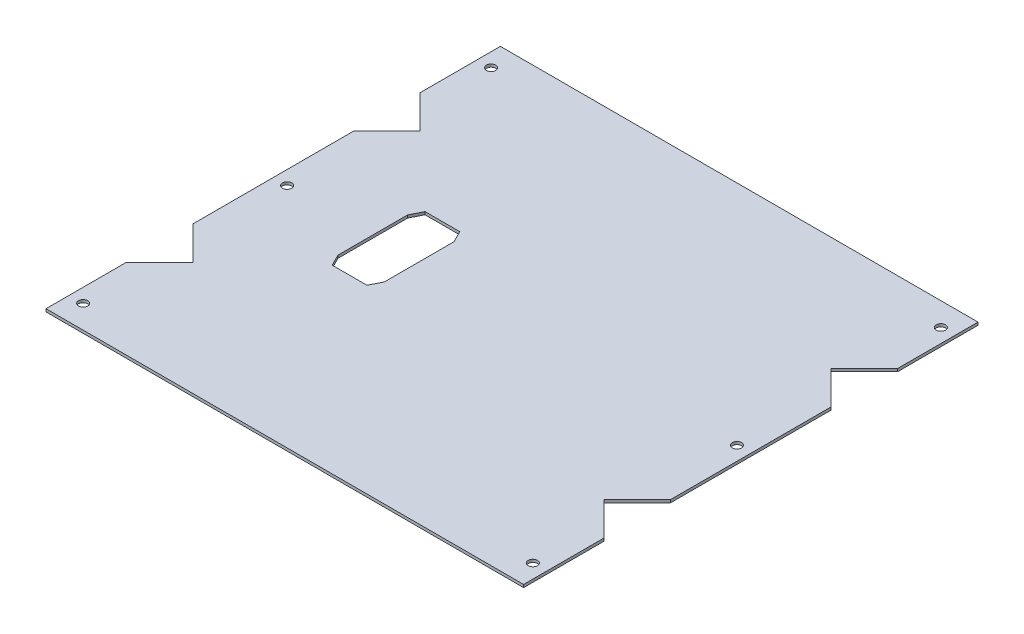
ISO-10303-21;
HEADER;
FILE_DESCRIPTION(('STEP AP214'),'2;1');
FILE_NAME('part.step','',(''),(''),'','','');
FILE_SCHEMA(('AUTOMOTIVE_DESIGN { 1 0 10303 214 1 1 1 1 }'));
ENDSEC;
DATA;
#1=APPLICATION_CONTEXT('core data for automotive mechanical design processes');
#2=APPLICATION_PROTOCOL_DEFINITION('international standard','automotive_design',2000,#1);
#3=PRODUCT_CONTEXT('',#1,'mechanical');
#4=PRODUCT('Part','Part','',(#3));
#5=PRODUCT_RELATED_PRODUCT_CATEGORY('part','',(#4));
#6=PRODUCT_DEFINITION_FORMATION('','',#4);
#7=PRODUCT_DEFINITION_CONTEXT('part definition',#1,'design');
#8=PRODUCT_DEFINITION('design','',#6,#7);
#9=PRODUCT_DEFINITION_SHAPE('','',#8);
#10=(LENGTH_UNIT() NAMED_UNIT(*) SI_UNIT(.MILLI.,.METRE.));
#11=(NAMED_UNIT(*) PLANE_ANGLE_UNIT() SI_UNIT($,.RADIAN.));
#12=(NAMED_UNIT(*) SI_UNIT($,.STERADIAN.) SOLID_ANGLE_UNIT());
#13=UNCERTAINTY_MEASURE_WITH_UNIT(LENGTH_MEASURE(1.E-05),#10,'distance_accuracy_value','');
#14=(GEOMETRIC_REPRESENTATION_CONTEXT(3) GLOBAL_UNCERTAINTY_ASSIGNED_CONTEXT((#13)) GLOBAL_UNIT_ASSIGNED_CONTEXT((#10,
#11,#12)) REPRESENTATION_CONTEXT('',''));
#15=CARTESIAN_POINT('',(0.,0.,0.));
#16=DIRECTION('',(0.,0.,1.));
#17=DIRECTION('',(1.,0.,0.));
#18=AXIS2_PLACEMENT_3D('',#15,#16,#17);
#19=CARTESIAN_POINT('',(0.,-1.2,0.));
#20=DIRECTION('',(0.,-1.,0.));
#21=DIRECTION('',(0.,0.,-1.));
#22=AXIS2_PLACEMENT_3D('',#19,#20,#21);
#23=PLANE('',#22);
#24=DIRECTION('',(0.707106781186546,0.,-0.707106781186549));
#25=VECTOR('',#24,1.);
#26=CARTESIAN_POINT('',(90.1247785636564,-1.19999999999997,47.4464466094067));
#27=LINE('',#26,#25);
#28=CARTESIAN_POINT('',(88.6088358912349,-1.19999999999996,48.9623892818283));
#29=VERTEX_POINT('',#28);
#30=CARTESIAN_POINT('',(102.924778563656,-1.20000000000005,34.6464466094067));
#31=VERTEX_POINT('',#30);
#32=EDGE_CURVE('E878',#29,#31,#27,.T.);
#33=ORIENTED_EDGE('',*,*,#32,.F.);
#34=DIRECTION('',(-0.707106781186546,0.,-0.707106781186549));
#35=VECTOR('',#34,1.);
#36=CARTESIAN_POINT('',(124.884275797213,-1.20000000000044,85.2378291878067));
#37=LINE('',#36,#35);
#38=CARTESIAN_POINT('',(102.924778563656,-1.20000000000017,63.2783319542498));
#39=VERTEX_POINT('',#38);
#40=EDGE_CURVE('E749',#39,#29,#37,.T.);
#41=ORIENTED_EDGE('',*,*,#40,.F.);
#42=DIRECTION('',(0.,0.,1.));
#43=VECTOR('',#42,1.);
#44=CARTESIAN_POINT('',(102.924778563656,-1.20000000000006,49.1247785636563));
#45=LINE('',#44,#43);
#46=CARTESIAN_POINT('',(102.924778563656,-1.2000000000004,97.9247785636565));
#47=VERTEX_POINT('',#46);
#48=EDGE_CURVE('E775',#39,#47,#45,.T.);
#49=ORIENTED_EDGE('',*,*,#48,.T.);
#50=DIRECTION('',(-1.,0.,0.));
#51=VECTOR('',#50,1.);
#52=CARTESIAN_POINT('',(137.924778563656,-1.20000000000064,97.9247785636565));
#53=LINE('',#52,#51);
#54=CARTESIAN_POINT('',(-102.924778563656,-1.2000000000004,97.9247785636565));
#55=VERTEX_POINT('',#54);
#56=EDGE_CURVE('E772',#47,#55,#53,.T.);
#57=ORIENTED_EDGE('',*,*,#56,.T.);
#58=DIRECTION('',(0.,0.,-1.));
#59=VECTOR('',#58,1.);
#60=CARTESIAN_POINT('',(-102.924778563656,-1.20000000000008,49.1247785636563));
#61=LINE('',#60,#59);
#62=CARTESIAN_POINT('',(-102.924778563656,-1.20000000000018,63.2783319542498));
#63=VERTEX_POINT('',#62);
#64=EDGE_CURVE('E764',#55,#63,#61,.T.);
#65=ORIENTED_EDGE('',*,*,#64,.T.);
#66=DIRECTION('',(-0.707106781186546,0.,0.707106781186549));
#67=VECTOR('',#66,1.);
#68=CARTESIAN_POINT('',(-90.1247785636564,-1.2,50.4783319542498));
#69=LINE('',#68,#67);
#70=CARTESIAN_POINT('',(-88.6088358912349,-1.19999999999999,48.9623892818283));
#71=VERTEX_POINT('',#70);
#72=EDGE_CURVE('E761',#71,#63,#69,.T.);
#73=ORIENTED_EDGE('',*,*,#72,.F.);
#74=DIRECTION('',(0.707106781186546,0.,0.707106781186549));
#75=VECTOR('',#74,1.);
#76=CARTESIAN_POINT('',(-157.837189477156,-1.20000000000048,-20.2659643040926));
#77=LINE('',#76,#75);
#78=CARTESIAN_POINT('',(-102.924778563656,-1.2000000000001,34.6464466094067));
#79=VERTEX_POINT('',#78);
#80=EDGE_CURVE('E918',#79,#71,#77,.T.);
#81=ORIENTED_EDGE('',*,*,#80,.F.);
#82=DIRECTION('',(0.,0.,-1.));
#83=VECTOR('',#82,1.);
#84=CARTESIAN_POINT('',(-102.924778563656,-1.20000000000012,0.));
#85=LINE('',#84,#83);
#86=CARTESIAN_POINT('',(-102.924778563656,-1.20000000000013,-34.6464466094066));
#87=VERTEX_POINT('',#86);
#88=EDGE_CURVE('E926',#79,#87,#85,.T.);
#89=ORIENTED_EDGE('',*,*,#88,.T.);
#90=DIRECTION('',(-0.707106781186545,0.,0.70710678118655));
#91=VECTOR('',#90,1.);
#92=CARTESIAN_POINT('',(-90.1247785636564,-1.20000000000005,-47.4464466094067));
#93=LINE('',#92,#91);
#94=CARTESIAN_POINT('',(-88.6088358912349,-1.20000000000005,-48.9623892818282));
#95=VERTEX_POINT('',#94);
#96=EDGE_CURVE('E906',#95,#87,#93,.T.);
#97=ORIENTED_EDGE('',*,*,#96,.F.);
#98=DIRECTION('',(0.707106781186545,0.,0.70710678118655));
#99=VECTOR('',#98,1.);
#100=CARTESIAN_POINT('',(-124.884275797213,-1.20000000000034,-85.2378291878066));
#101=LINE('',#100,#99);
#102=CARTESIAN_POINT('',(-102.924778563656,-1.20000000000014,-63.2783319542498));
#103=VERTEX_POINT('',#102);
#104=EDGE_CURVE('E814',#103,#95,#101,.T.);
#105=ORIENTED_EDGE('',*,*,#104,.F.);
#106=DIRECTION('',(0.,0.,-1.));
#107=VECTOR('',#106,1.);
#108=CARTESIAN_POINT('',(-102.924778563656,-1.20000000000009,-49.1247785636564));
#109=LINE('',#108,#107);
#110=CARTESIAN_POINT('',(-102.924778563656,-1.20000000000026,-97.9247785636564));
#111=VERTEX_POINT('',#110);
#112=EDGE_CURVE('E827',#103,#111,#109,.T.);
#113=ORIENTED_EDGE('',*,*,#112,.T.);
#114=DIRECTION('',(1.,0.,0.));
#115=VECTOR('',#114,1.);
#116=CARTESIAN_POINT('',(137.924778563656,-1.2000000000005,-97.9247785636564));
#117=LINE('',#116,#115);
#118=CARTESIAN_POINT('',(102.924778563656,-1.20000000000026,-97.9247785636564));
#119=VERTEX_POINT('',#118);
#120=EDGE_CURVE('E839',#111,#119,#117,.T.);
#121=ORIENTED_EDGE('',*,*,#120,.T.);
#122=DIRECTION('',(0.,0.,1.));
#123=VECTOR('',#122,1.);
#124=CARTESIAN_POINT('',(102.924778563656,-1.20000000000009,-49.1247785636564));
#125=LINE('',#124,#123);
#126=CARTESIAN_POINT('',(102.924778563656,-1.20000000000014,-63.2783319542498));
#127=VERTEX_POINT('',#126);
#128=EDGE_CURVE('E835',#119,#127,#125,.T.);
#129=ORIENTED_EDGE('',*,*,#128,.T.);
#130=DIRECTION('',(0.707106781186545,0.,-0.70710678118655));
#131=VECTOR('',#130,1.);
#132=CARTESIAN_POINT('',(90.1247785636564,-1.20000000000001,-50.4783319542497));
#133=LINE('',#132,#131);
#134=CARTESIAN_POINT('',(88.6088358912349,-1.2,-48.9623892818282));
#135=VERTEX_POINT('',#134);
#136=EDGE_CURVE('E824',#135,#127,#133,.T.);
#137=ORIENTED_EDGE('',*,*,#136,.F.);
#138=DIRECTION('',(-0.707106781186545,0.,-0.70710678118655));
#139=VECTOR('',#138,1.);
#140=CARTESIAN_POINT('',(157.837189477155,-1.20000000000045,20.2659643040927));
#141=LINE('',#140,#139);
#142=CARTESIAN_POINT('',(102.924778563656,-1.20000000000008,-34.6464466094066));
#143=VERTEX_POINT('',#142);
#144=EDGE_CURVE('E729',#143,#135,#141,.T.);
#145=ORIENTED_EDGE('',*,*,#144,.F.);
#146=DIRECTION('',(0.,0.,1.));
#147=VECTOR('',#146,1.);
#148=CARTESIAN_POINT('',(102.924778563656,-1.20000000000006,0.));
#149=LINE('',#148,#147);
#150=EDGE_CURVE('E889',#143,#31,#149,.T.);
#151=ORIENTED_EDGE('',*,*,#150,.T.);
#152=EDGE_LOOP('',(#33,#41,#49,#57,#65,#73,#81,#89,#97,#105,#113,#121,#129,#137,#145,#151));
#153=FACE_BOUND('',#152,.T.);
#154=DIRECTION('',(-1.,0.,0.));
#155=VECTOR('',#154,1.);
#156=CARTESIAN_POINT('',(-57.5,-1.2,20.));
#157=LINE('',#156,#155);
#158=CARTESIAN_POINT('',(-42.5,-1.2,20.));
#159=VERTEX_POINT('',#158);
#160=CARTESIAN_POINT('',(-57.5,-1.2,20.));
#161=VERTEX_POINT('',#160);
#162=EDGE_CURVE('E557',#159,#161,#157,.T.);
#163=ORIENTED_EDGE('',*,*,#162,.F.);
#164=DIRECTION('',(-0.447213595499958,0.,0.894427190999916));
#165=VECTOR('',#164,1.);
#166=CARTESIAN_POINT('',(-42.5,-1.2,20.));
#167=LINE('',#166,#165);
#168=CARTESIAN_POINT('',(-40.,-1.2,15.));
#169=VERTEX_POINT('',#168);
#170=EDGE_CURVE('E964',#169,#159,#167,.T.);
#171=ORIENTED_EDGE('',*,*,#170,.F.);
#172=DIRECTION('',(0.,0.,1.));
#173=VECTOR('',#172,1.);
#174=CARTESIAN_POINT('',(-40.,-1.2,15.));
#175=LINE('',#174,#173);
#176=CARTESIAN_POINT('',(-40.,-1.2,-15.));
#177=VERTEX_POINT('',#176);
#178=EDGE_CURVE('E960',#177,#169,#175,.T.);
#179=ORIENTED_EDGE('',*,*,#178,.F.);
#180=DIRECTION('',(0.44721359549996,0.,0.894427190999915));
#181=VECTOR('',#180,1.);
#182=CARTESIAN_POINT('',(-42.5,-1.2,-20.));
#183=LINE('',#182,#181);
#184=CARTESIAN_POINT('',(-42.5,-1.2,-20.));
#185=VERTEX_POINT('',#184);
#186=EDGE_CURVE('E956',#185,#177,#183,.T.);
#187=ORIENTED_EDGE('',*,*,#186,.F.);
#188=DIRECTION('',(1.,0.,0.));
#189=VECTOR('',#188,1.);
#190=CARTESIAN_POINT('',(-57.5,-1.2,-20.));
#191=LINE('',#190,#189);
#192=CARTESIAN_POINT('',(-57.5,-1.2,-20.));
#193=VERTEX_POINT('',#192);
#194=EDGE_CURVE('E952',#193,#185,#191,.T.);
#195=ORIENTED_EDGE('',*,*,#194,.F.);
#196=DIRECTION('',(0.447213595499957,0.,-0.894427190999916));
#197=VECTOR('',#196,1.);
#198=CARTESIAN_POINT('',(-60.,-1.2,-15.));
#199=LINE('',#198,#197);
#200=CARTESIAN_POINT('',(-60.,-1.2,-15.));
#201=VERTEX_POINT('',#200);
#202=EDGE_CURVE('E948',#201,#193,#199,.T.);
#203=ORIENTED_EDGE('',*,*,#202,.F.);
#204=DIRECTION('',(0.,0.,-1.));
#205=VECTOR('',#204,1.);
#206=CARTESIAN_POINT('',(-60.,-1.2,15.));
#207=LINE('',#206,#205);
#208=CARTESIAN_POINT('',(-60.,-1.2,15.));
#209=VERTEX_POINT('',#208);
#210=EDGE_CURVE('E944',#209,#201,#207,.T.);
#211=ORIENTED_EDGE('',*,*,#210,.F.);
#212=DIRECTION('',(-0.447213595499958,0.,-0.894427190999916));
#213=VECTOR('',#212,1.);
#214=CARTESIAN_POINT('',(-57.5,-1.2,20.));
#215=LINE('',#214,#213);
#216=EDGE_CURVE('E941',#161,#209,#215,.T.);
#217=ORIENTED_EDGE('',*,*,#216,.F.);
#218=EDGE_LOOP('',(#163,#171,#179,#187,#195,#203,#211,#217));
#219=FACE_BOUND('',#218,.T.);
#220=CARTESIAN_POINT('',(-96.9247785636562,-1.2000000000003,-5.28261009814852E-13));
#221=DIRECTION('',(0.,1.,0.));
#222=DIRECTION('',(0.,0.,-1.));
#223=AXIS2_PLACEMENT_3D('',#220,#221,#222);
#224=CIRCLE('',#223,2.);
#225=CARTESIAN_POINT('',(-96.9247785636562,-1.20000000000029,-2.00000000000053));
#226=VERTEX_POINT('',#225);
#227=EDGE_CURVE('E929',#226,#226,#224,.T.);
#228=ORIENTED_EDGE('',*,*,#227,.T.);
#229=EDGE_LOOP('',(#228));
#230=FACE_BOUND('',#229,.T.);
#231=CARTESIAN_POINT('',(96.9247785636564,-1.20000000000013,0.));
#232=DIRECTION('',(0.,-1.,0.));
#233=DIRECTION('',(0.,0.,-1.));
#234=AXIS2_PLACEMENT_3D('',#231,#232,#233);
#235=CIRCLE('',#234,2.);
#236=CARTESIAN_POINT('',(96.9247785636564,-1.20000000000014,-1.99999999999999));
#237=VERTEX_POINT('',#236);
#238=EDGE_CURVE('E892',#237,#237,#235,.T.);
#239=ORIENTED_EDGE('',*,*,#238,.F.);
#240=EDGE_LOOP('',(#239));
#241=FACE_BOUND('',#240,.T.);
#242=CARTESIAN_POINT('',(-96.9247785636559,-1.2000000000003,-87.9247785636562));
#243=DIRECTION('',(0.,1.,0.));
#244=DIRECTION('',(1.,0.,0.));
#245=AXIS2_PLACEMENT_3D('',#242,#243,#244);
#246=CIRCLE('',#245,2.);
#247=CARTESIAN_POINT('',(-94.9247785636559,-1.20000000000029,-87.9247785636562));
#248=VERTEX_POINT('',#247);
#249=EDGE_CURVE('E831',#248,#248,#246,.T.);
#250=ORIENTED_EDGE('',*,*,#249,.T.);
#251=EDGE_LOOP('',(#250));
#252=FACE_BOUND('',#251,.T.);
#253=CARTESIAN_POINT('',(96.9247785636565,-1.20000000000038,-87.9247785636564));
#254=DIRECTION('',(0.,-1.,0.));
#255=DIRECTION('',(-1.,0.,0.));
#256=AXIS2_PLACEMENT_3D('',#253,#254,#255);
#257=CIRCLE('',#256,2.);
#258=CARTESIAN_POINT('',(94.9247785636565,-1.20000000000038,-87.9247785636564));
#259=VERTEX_POINT('',#258);
#260=EDGE_CURVE('E866',#259,#259,#257,.T.);
#261=ORIENTED_EDGE('',*,*,#260,.F.);
#262=EDGE_LOOP('',(#261));
#263=FACE_BOUND('',#262,.T.);
#264=CARTESIAN_POINT('',(-96.9247785636571,-1.2000000000007,87.9247785636563));
#265=DIRECTION('',(0.,1.,0.));
#266=DIRECTION('',(-1.,0.,0.));
#267=AXIS2_PLACEMENT_3D('',#264,#265,#266);
#268=CIRCLE('',#267,2.);
#269=CARTESIAN_POINT('',(-98.9247785636571,-1.2000000000007,87.9247785636563));
#270=VERTEX_POINT('',#269);
#271=EDGE_CURVE('E768',#270,#270,#268,.T.);
#272=ORIENTED_EDGE('',*,*,#271,.T.);
#273=EDGE_LOOP('',(#272));
#274=FACE_BOUND('',#273,.T.);
#275=CARTESIAN_POINT('',(96.9247785636566,-1.20000000000027,87.9247785636565));
#276=DIRECTION('',(0.,-1.,0.));
#277=DIRECTION('',(1.,0.,0.));
#278=AXIS2_PLACEMENT_3D('',#275,#276,#277);
#279=CIRCLE('',#278,2.);
#280=CARTESIAN_POINT('',(98.9247785636566,-1.20000000000028,87.9247785636565));
#281=VERTEX_POINT('',#280);
#282=EDGE_CURVE('E807',#281,#281,#279,.T.);
#283=ORIENTED_EDGE('',*,*,#282,.F.);
#284=EDGE_LOOP('',(#283));
#285=FACE_BOUND('',#284,.T.);
#286=ADVANCED_FACE('F541',(#153,#219,#230,#241,#252,#263,#274,#285),#23,.T.);
#287=CARTESIAN_POINT('',(0.,0.,0.));
#288=DIRECTION('',(0.,-1.,0.));
#289=DIRECTION('',(0.,0.,-1.));
#290=AXIS2_PLACEMENT_3D('',#287,#288,#289);
#291=PLANE('',#290);
#292=DIRECTION('',(-0.707106781186546,0.,-0.707106781186549));
#293=VECTOR('',#292,1.);
#294=CARTESIAN_POINT('',(113.34800186836,-3.05311331771918E-13,73.7015552589529));
#295=LINE('',#294,#293);
#296=CARTESIAN_POINT('',(102.924778563656,-1.59594559789866E-13,63.2783319542498));
#297=VERTEX_POINT('',#296);
#298=CARTESIAN_POINT('',(88.6088358912349,0.,48.9623892818283));
#299=VERTEX_POINT('',#298);
#300=EDGE_CURVE('E778',#297,#299,#295,.T.);
#301=ORIENTED_EDGE('',*,*,#300,.T.);
#302=DIRECTION('',(0.707106781186546,0.,-0.707106781186549));
#303=VECTOR('',#302,1.);
#304=CARTESIAN_POINT('',(113.34800186836,-1.2490009027033E-13,24.2232233047034));
#305=LINE('',#304,#303);
#306=CARTESIAN_POINT('',(102.924778563656,0.,34.6464466094067));
#307=VERTEX_POINT('',#306);
#308=EDGE_CURVE('E728',#299,#307,#305,.T.);
#309=ORIENTED_EDGE('',*,*,#308,.T.);
#310=DIRECTION('',(0.,0.,-1.));
#311=VECTOR('',#310,1.);
#312=CARTESIAN_POINT('',(102.924778563656,0.,47.8));
#313=LINE('',#312,#311);
#314=CARTESIAN_POINT('',(102.924778563656,0.,-34.6464466094066));
#315=VERTEX_POINT('',#314);
#316=EDGE_CURVE('E724',#315,#307,#313,.F.);
#317=ORIENTED_EDGE('',*,*,#316,.F.);
#318=DIRECTION('',(-0.707106781186545,0.,-0.70710678118655));
#319=VECTOR('',#318,1.);
#320=CARTESIAN_POINT('',(113.34800186836,-1.38777878078145E-13,-24.2232233047033));
#321=LINE('',#320,#319);
#322=CARTESIAN_POINT('',(88.608835891235,0.,-48.9623892818282));
#323=VERTEX_POINT('',#322);
#324=EDGE_CURVE('E720',#315,#323,#321,.T.);
#325=ORIENTED_EDGE('',*,*,#324,.T.);
#326=DIRECTION('',(0.707106781186545,0.,-0.70710678118655));
#327=VECTOR('',#326,1.);
#328=CARTESIAN_POINT('',(113.34800186836,-2.4980018054066E-13,-73.701555258953));
#329=LINE('',#328,#327);
#330=CARTESIAN_POINT('',(102.924778563656,-1.31838984174237E-13,-63.2783319542498));
#331=VERTEX_POINT('',#330);
#332=EDGE_CURVE('E704',#323,#331,#329,.T.);
#333=ORIENTED_EDGE('',*,*,#332,.T.);
#334=DIRECTION('',(0.,0.,-1.));
#335=VECTOR('',#334,1.);
#336=CARTESIAN_POINT('',(102.924778563656,0.,-50.1247785636564));
#337=LINE('',#336,#335);
#338=CARTESIAN_POINT('',(102.924778563656,-2.56739074444567E-13,-97.9247785636564));
#339=VERTEX_POINT('',#338);
#340=EDGE_CURVE('E716',#339,#331,#337,.F.);
#341=ORIENTED_EDGE('',*,*,#340,.F.);
#342=DIRECTION('',(-1.,0.,0.));
#343=VECTOR('',#342,1.);
#344=CARTESIAN_POINT('',(102.924778563656,-2.56739074444567E-13,-97.9247785636564));
#345=LINE('',#344,#343);
#346=CARTESIAN_POINT('',(-102.924778563656,-2.56739074444567E-13,-97.9247785636564));
#347=VERTEX_POINT('',#346);
#348=EDGE_CURVE('E863',#347,#339,#345,.F.);
#349=ORIENTED_EDGE('',*,*,#348,.F.);
#350=DIRECTION('',(0.,0.,1.));
#351=VECTOR('',#350,1.);
#352=CARTESIAN_POINT('',(-102.924778563656,-2.56739074444567E-13,-97.9247785636564));
#353=LINE('',#352,#351);
#354=CARTESIAN_POINT('',(-102.924778563656,-1.31838984174237E-13,-63.2783319542498));
#355=VERTEX_POINT('',#354);
#356=EDGE_CURVE('E715',#355,#347,#353,.F.);
#357=ORIENTED_EDGE('',*,*,#356,.F.);
#358=DIRECTION('',(0.707106781186545,0.,0.70710678118655));
#359=VECTOR('',#358,1.);
#360=CARTESIAN_POINT('',(-113.348001868359,-2.4980018054066E-13,-73.701555258953));
#361=LINE('',#360,#359);
#362=CARTESIAN_POINT('',(-88.6088358912349,0.,-48.9623892818282));
#363=VERTEX_POINT('',#362);
#364=EDGE_CURVE('E842',#355,#363,#361,.T.);
#365=ORIENTED_EDGE('',*,*,#364,.T.);
#366=DIRECTION('',(-0.707106781186545,0.,0.70710678118655));
#367=VECTOR('',#366,1.);
#368=CARTESIAN_POINT('',(-113.34800186836,-1.94289029309402E-13,-24.2232233047033));
#369=LINE('',#368,#367);
#370=CARTESIAN_POINT('',(-102.924778563656,0.,-34.6464466094066));
#371=VERTEX_POINT('',#370);
#372=EDGE_CURVE('E910',#363,#371,#369,.T.);
#373=ORIENTED_EDGE('',*,*,#372,.T.);
#374=DIRECTION('',(0.,0.,1.));
#375=VECTOR('',#374,1.);
#376=CARTESIAN_POINT('',(-102.924778563656,-1.2490009027033E-13,-47.8));
#377=LINE('',#376,#375);
#378=CARTESIAN_POINT('',(-102.924778563656,0.,34.6464466094067));
#379=VERTEX_POINT('',#378);
#380=EDGE_CURVE('E877',#379,#371,#377,.F.);
#381=ORIENTED_EDGE('',*,*,#380,.F.);
#382=DIRECTION('',(0.707106781186546,0.,0.707106781186549));
#383=VECTOR('',#382,1.);
#384=CARTESIAN_POINT('',(-113.34800186836,-1.80411241501588E-13,24.2232233047034));
#385=LINE('',#384,#383);
#386=CARTESIAN_POINT('',(-88.6088358912349,0.,48.9623892818283));
#387=VERTEX_POINT('',#386);
#388=EDGE_CURVE('E914',#379,#387,#385,.T.);
#389=ORIENTED_EDGE('',*,*,#388,.T.);
#390=DIRECTION('',(-0.707106781186546,0.,0.707106781186549));
#391=VECTOR('',#390,1.);
#392=CARTESIAN_POINT('',(-113.34800186836,-3.05311331771918E-13,73.7015552589529));
#393=LINE('',#392,#391);
#394=CARTESIAN_POINT('',(-102.924778563656,-1.59594559789866E-13,63.2783319542498));
#395=VERTEX_POINT('',#394);
#396=EDGE_CURVE('E784',#387,#395,#393,.T.);
#397=ORIENTED_EDGE('',*,*,#396,.T.);
#398=DIRECTION('',(0.,0.,1.));
#399=VECTOR('',#398,1.);
#400=CARTESIAN_POINT('',(-102.924778563656,0.,50.1247785636566));
#401=LINE('',#400,#399);
#402=CARTESIAN_POINT('',(-102.924778563656,-3.95516952522712E-13,97.9247785636565));
#403=VERTEX_POINT('',#402);
#404=EDGE_CURVE('E788',#403,#395,#401,.F.);
#405=ORIENTED_EDGE('',*,*,#404,.F.);
#406=DIRECTION('',(1.,0.,0.));
#407=VECTOR('',#406,1.);
#408=CARTESIAN_POINT('',(89.1247785636564,-3.12250225675825E-13,97.9247785636565));
#409=LINE('',#408,#407);
#410=CARTESIAN_POINT('',(102.924778563656,-3.95516952522712E-13,97.9247785636565));
#411=VERTEX_POINT('',#410);
#412=EDGE_CURVE('E796',#411,#403,#409,.F.);
#413=ORIENTED_EDGE('',*,*,#412,.F.);
#414=DIRECTION('',(0.,0.,-1.));
#415=VECTOR('',#414,1.);
#416=CARTESIAN_POINT('',(102.924778563656,-3.95516952522712E-13,97.9247785636565));
#417=LINE('',#416,#415);
#418=EDGE_CURVE('E781',#297,#411,#417,.F.);
#419=ORIENTED_EDGE('',*,*,#418,.F.);
#420=EDGE_LOOP('',(#301,#309,#317,#325,#333,#341,#349,#357,#365,#373,#381,#389,#397,#405,#413,#419));
#421=FACE_BOUND('',#420,.T.);
#422=DIRECTION('',(-0.447213595499958,0.,0.894427190999916));
#423=VECTOR('',#422,1.);
#424=CARTESIAN_POINT('',(-26.,0.,-13.));
#425=LINE('',#424,#423);
#426=CARTESIAN_POINT('',(-40.,0.,15.));
#427=VERTEX_POINT('',#426);
#428=CARTESIAN_POINT('',(-42.5,0.,20.));
#429=VERTEX_POINT('',#428);
#430=EDGE_CURVE('E550',#427,#429,#425,.T.);
#431=ORIENTED_EDGE('',*,*,#430,.T.);
#432=DIRECTION('',(-1.,0.,0.));
#433=VECTOR('',#432,1.);
#434=CARTESIAN_POINT('',(0.,0.,20.));
#435=LINE('',#434,#433);
#436=CARTESIAN_POINT('',(-57.5,0.,20.));
#437=VERTEX_POINT('',#436);
#438=EDGE_CURVE('E13',#429,#437,#435,.T.);
#439=ORIENTED_EDGE('',*,*,#438,.T.);
#440=DIRECTION('',(-0.447213595499958,0.,-0.894427190999916));
#441=VECTOR('',#440,1.);
#442=CARTESIAN_POINT('',(-54.,0.,27.));
#443=LINE('',#442,#441);
#444=CARTESIAN_POINT('',(-60.,0.,15.));
#445=VERTEX_POINT('',#444);
#446=EDGE_CURVE('E972',#437,#445,#443,.T.);
#447=ORIENTED_EDGE('',*,*,#446,.T.);
#448=DIRECTION('',(0.,0.,-1.));
#449=VECTOR('',#448,1.);
#450=CARTESIAN_POINT('',(-60.,0.,0.));
#451=LINE('',#450,#449);
#452=CARTESIAN_POINT('',(-60.,0.,-15.));
#453=VERTEX_POINT('',#452);
#454=EDGE_CURVE('E995',#445,#453,#451,.T.);
#455=ORIENTED_EDGE('',*,*,#454,.T.);
#456=DIRECTION('',(0.447213595499957,0.,-0.894427190999916));
#457=VECTOR('',#456,1.);
#458=CARTESIAN_POINT('',(-54.,0.,-26.9999999999999));
#459=LINE('',#458,#457);
#460=CARTESIAN_POINT('',(-57.5,0.,-20.));
#461=VERTEX_POINT('',#460);
#462=EDGE_CURVE('E999',#453,#461,#459,.T.);
#463=ORIENTED_EDGE('',*,*,#462,.T.);
#464=DIRECTION('',(1.,0.,0.));
#465=VECTOR('',#464,1.);
#466=CARTESIAN_POINT('',(0.,0.,-20.));
#467=LINE('',#466,#465);
#468=CARTESIAN_POINT('',(-42.5,0.,-20.));
#469=VERTEX_POINT('',#468);
#470=EDGE_CURVE('E1003',#461,#469,#467,.T.);
#471=ORIENTED_EDGE('',*,*,#470,.T.);
#472=DIRECTION('',(0.44721359549996,0.,0.894427190999915));
#473=VECTOR('',#472,1.);
#474=CARTESIAN_POINT('',(-25.9999999999999,0.,13.));
#475=LINE('',#474,#473);
#476=CARTESIAN_POINT('',(-40.,0.,-15.));
#477=VERTEX_POINT('',#476);
#478=EDGE_CURVE('E1007',#469,#477,#475,.T.);
#479=ORIENTED_EDGE('',*,*,#478,.T.);
#480=DIRECTION('',(0.,0.,1.));
#481=VECTOR('',#480,1.);
#482=CARTESIAN_POINT('',(-40.,0.,0.));
#483=LINE('',#482,#481);
#484=EDGE_CURVE('E1011',#477,#427,#483,.T.);
#485=ORIENTED_EDGE('',*,*,#484,.T.);
#486=EDGE_LOOP('',(#431,#439,#447,#455,#463,#471,#479,#485));
#487=FACE_BOUND('',#486,.T.);
#488=CARTESIAN_POINT('',(-96.9247785636562,0.,-5.24640717343247E-13));
#489=DIRECTION('',(0.,1.,0.));
#490=DIRECTION('',(-1.,0.,0.));
#491=AXIS2_PLACEMENT_3D('',#488,#489,#490);
#492=CIRCLE('',#491,2.);
#493=CARTESIAN_POINT('',(-98.9247785636562,0.,-5.24640717343247E-13));
#494=VERTEX_POINT('',#493);
#495=EDGE_CURVE('E933',#494,#494,#492,.T.);
#496=ORIENTED_EDGE('',*,*,#495,.F.);
#497=EDGE_LOOP('',(#496));
#498=FACE_BOUND('',#497,.T.);
#499=CARTESIAN_POINT('',(96.9247785636565,0.,0.));
#500=DIRECTION('',(0.,1.,0.));
#501=DIRECTION('',(-1.,0.,0.));
#502=AXIS2_PLACEMENT_3D('',#499,#500,#501);
#503=CIRCLE('',#502,2.);
#504=CARTESIAN_POINT('',(94.9247785636565,0.,0.));
#505=VERTEX_POINT('',#504);
#506=EDGE_CURVE('E896',#505,#505,#503,.T.);
#507=ORIENTED_EDGE('',*,*,#506,.F.);
#508=EDGE_LOOP('',(#507));
#509=FACE_BOUND('',#508,.T.);
#510=CARTESIAN_POINT('',(-96.9247785636559,-1.94289029309402E-13,-87.9247785636562));
#511=DIRECTION('',(0.,1.,0.));
#512=DIRECTION('',(1.,0.,0.));
#513=AXIS2_PLACEMENT_3D('',#510,#511,#512);
#514=CIRCLE('',#513,2.);
#515=CARTESIAN_POINT('',(-94.9247785636559,-1.8127224584571E-13,-87.9247785636562));
#516=VERTEX_POINT('',#515);
#517=EDGE_CURVE('E855',#516,#516,#514,.T.);
#518=ORIENTED_EDGE('',*,*,#517,.F.);
#519=EDGE_LOOP('',(#518));
#520=FACE_BOUND('',#519,.T.);
#521=CARTESIAN_POINT('',(96.9247785636565,-2.08166817117217E-13,-87.9247785636564));
#522=DIRECTION('',(0.,1.,0.));
#523=DIRECTION('',(1.,0.,0.));
#524=AXIS2_PLACEMENT_3D('',#521,#522,#523);
#525=CIRCLE('',#524,2.);
#526=CARTESIAN_POINT('',(98.9247785636565,-2.21183600580909E-13,-87.9247785636564));
#527=VERTEX_POINT('',#526);
#528=EDGE_CURVE('E753',#527,#527,#525,.T.);
#529=ORIENTED_EDGE('',*,*,#528,.F.);
#530=EDGE_LOOP('',(#529));
#531=FACE_BOUND('',#530,.T.);
#532=CARTESIAN_POINT('',(96.9247785636566,-3.19189119579733E-13,87.9247785636565));
#533=DIRECTION('',(0.,1.,0.));
#534=DIRECTION('',(-1.,0.,0.));
#535=AXIS2_PLACEMENT_3D('',#532,#533,#534);
#536=CIRCLE('',#535,2.);
#537=CARTESIAN_POINT('',(94.9247785636566,-3.0617233611604E-13,87.9247785636565));
#538=VERTEX_POINT('',#537);
#539=EDGE_CURVE('E748',#538,#538,#536,.T.);
#540=ORIENTED_EDGE('',*,*,#539,.F.);
#541=EDGE_LOOP('',(#540));
#542=FACE_BOUND('',#541,.T.);
#543=CARTESIAN_POINT('',(-96.9247785636571,-3.05311331771918E-13,87.9247785636563));
#544=DIRECTION('',(0.,1.,0.));
#545=DIRECTION('',(-1.,0.,0.));
#546=AXIS2_PLACEMENT_3D('',#543,#544,#545);
#547=CIRCLE('',#546,2.);
#548=CARTESIAN_POINT('',(-98.9247785636571,-3.18328115235611E-13,87.9247785636563));
#549=VERTEX_POINT('',#548);
#550=EDGE_CURVE('E803',#549,#549,#547,.T.);
#551=ORIENTED_EDGE('',*,*,#550,.F.);
#552=EDGE_LOOP('',(#551));
#553=FACE_BOUND('',#552,.T.);
#554=ADVANCED_FACE('F543',(#421,#487,#498,#509,#520,#531,#542,#553),#291,.F.);
#555=CARTESIAN_POINT('',(-57.5,48.8,20.));
#556=DIRECTION('',(0.,0.,1.));
#557=DIRECTION('',(1.,0.,0.));
#558=AXIS2_PLACEMENT_3D('',#555,#556,#557);
#559=PLANE('',#558);
#560=DIRECTION('',(0.,-1.,0.));
#561=VECTOR('',#560,1.);
#562=CARTESIAN_POINT('',(-42.5,48.8,20.));
#563=LINE('',#562,#561);
#564=EDGE_CURVE('E969',#429,#159,#563,.T.);
#565=ORIENTED_EDGE('',*,*,#564,.T.);
#566=ORIENTED_EDGE('',*,*,#162,.T.);
#567=DIRECTION('',(0.,-1.,0.));
#568=VECTOR('',#567,1.);
#569=CARTESIAN_POINT('',(-57.5,48.8,20.));
#570=LINE('',#569,#568);
#571=EDGE_CURVE('E968',#437,#161,#570,.T.);
#572=ORIENTED_EDGE('',*,*,#571,.F.);
#573=ORIENTED_EDGE('',*,*,#438,.F.);
#574=EDGE_LOOP('',(#565,#566,#572,#573));
#575=FACE_BOUND('',#574,.T.);
#576=ADVANCED_FACE('F1033',(#575),#559,.F.);
#577=CARTESIAN_POINT('',(-42.5,48.8,20.));
#578=DIRECTION('',(0.894427190999916,0.,0.447213595499958));
#579=DIRECTION('',(0.447213595499958,0.,-0.894427190999916));
#580=AXIS2_PLACEMENT_3D('',#577,#578,#579);
#581=PLANE('',#580);
#582=DIRECTION('',(0.,-1.,0.));
#583=VECTOR('',#582,1.);
#584=CARTESIAN_POINT('',(-40.,48.8,15.));
#585=LINE('',#584,#583);
#586=EDGE_CURVE('E973',#427,#169,#585,.T.);
#587=ORIENTED_EDGE('',*,*,#586,.T.);
#588=ORIENTED_EDGE('',*,*,#170,.T.);
#589=ORIENTED_EDGE('',*,*,#564,.F.);
#590=ORIENTED_EDGE('',*,*,#430,.F.);
#591=EDGE_LOOP('',(#587,#588,#589,#590));
#592=FACE_BOUND('',#591,.T.);
#593=ADVANCED_FACE('F1020',(#592),#581,.F.);
#594=CARTESIAN_POINT('',(-40.,48.8,15.));
#595=DIRECTION('',(1.,0.,0.));
#596=DIRECTION('',(0.,0.,-1.));
#597=AXIS2_PLACEMENT_3D('',#594,#595,#596);
#598=PLANE('',#597);
#599=DIRECTION('',(0.,-1.,0.));
#600=VECTOR('',#599,1.);
#601=CARTESIAN_POINT('',(-40.,48.8,-15.));
#602=LINE('',#601,#600);
#603=EDGE_CURVE('E976',#477,#177,#602,.T.);
#604=ORIENTED_EDGE('',*,*,#603,.T.);
#605=ORIENTED_EDGE('',*,*,#178,.T.);
#606=ORIENTED_EDGE('',*,*,#586,.F.);
#607=ORIENTED_EDGE('',*,*,#484,.F.);
#608=EDGE_LOOP('',(#604,#605,#606,#607));
#609=FACE_BOUND('',#608,.T.);
#610=ADVANCED_FACE('F1022',(#609),#598,.F.);
#611=CARTESIAN_POINT('',(-42.5,48.8,-20.));
#612=DIRECTION('',(0.894427190999915,0.,-0.44721359549996));
#613=DIRECTION('',(-0.44721359549996,0.,-0.894427190999915));
#614=AXIS2_PLACEMENT_3D('',#611,#612,#613);
#615=PLANE('',#614);
#616=DIRECTION('',(0.,-1.,0.));
#617=VECTOR('',#616,1.);
#618=CARTESIAN_POINT('',(-42.5,48.8,-20.));
#619=LINE('',#618,#617);
#620=EDGE_CURVE('E979',#469,#185,#619,.T.);
#621=ORIENTED_EDGE('',*,*,#620,.T.);
#622=ORIENTED_EDGE('',*,*,#186,.T.);
#623=ORIENTED_EDGE('',*,*,#603,.F.);
#624=ORIENTED_EDGE('',*,*,#478,.F.);
#625=EDGE_LOOP('',(#621,#622,#623,#624));
#626=FACE_BOUND('',#625,.T.);
#627=ADVANCED_FACE('F1139',(#626),#615,.F.);
#628=CARTESIAN_POINT('',(-57.5,48.8,-20.));
#629=DIRECTION('',(0.,0.,-1.));
#630=DIRECTION('',(-1.,0.,0.));
#631=AXIS2_PLACEMENT_3D('',#628,#629,#630);
#632=PLANE('',#631);
#633=DIRECTION('',(0.,-1.,0.));
#634=VECTOR('',#633,1.);
#635=CARTESIAN_POINT('',(-57.5,48.8,-20.));
#636=LINE('',#635,#634);
#637=EDGE_CURVE('E982',#461,#193,#636,.T.);
#638=ORIENTED_EDGE('',*,*,#637,.T.);
#639=ORIENTED_EDGE('',*,*,#194,.T.);
#640=ORIENTED_EDGE('',*,*,#620,.F.);
#641=ORIENTED_EDGE('',*,*,#470,.F.);
#642=EDGE_LOOP('',(#638,#639,#640,#641));
#643=FACE_BOUND('',#642,.T.);
#644=ADVANCED_FACE('F1142',(#643),#632,.F.);
#645=CARTESIAN_POINT('',(-60.,48.8,-15.));
#646=DIRECTION('',(-0.894427190999916,0.,-0.447213595499957));
#647=DIRECTION('',(-0.447213595499957,0.,0.894427190999916));
#648=AXIS2_PLACEMENT_3D('',#645,#646,#647);
#649=PLANE('',#648);
#650=DIRECTION('',(0.,-1.,0.));
#651=VECTOR('',#650,1.);
#652=CARTESIAN_POINT('',(-60.,48.8,-15.));
#653=LINE('',#652,#651);
#654=EDGE_CURVE('E985',#453,#201,#653,.T.);
#655=ORIENTED_EDGE('',*,*,#654,.T.);
#656=ORIENTED_EDGE('',*,*,#202,.T.);
#657=ORIENTED_EDGE('',*,*,#637,.F.);
#658=ORIENTED_EDGE('',*,*,#462,.F.);
#659=EDGE_LOOP('',(#655,#656,#657,#658));
#660=FACE_BOUND('',#659,.T.);
#661=ADVANCED_FACE('F1146',(#660),#649,.F.);
#662=CARTESIAN_POINT('',(-60.,48.8,15.));
#663=DIRECTION('',(-1.,0.,0.));
#664=DIRECTION('',(0.,0.,1.));
#665=AXIS2_PLACEMENT_3D('',#662,#663,#664);
#666=PLANE('',#665);
#667=DIRECTION('',(0.,-1.,0.));
#668=VECTOR('',#667,1.);
#669=CARTESIAN_POINT('',(-60.,48.8,15.));
#670=LINE('',#669,#668);
#671=EDGE_CURVE('E565',#445,#209,#670,.T.);
#672=ORIENTED_EDGE('',*,*,#671,.T.);
#673=ORIENTED_EDGE('',*,*,#210,.T.);
#674=ORIENTED_EDGE('',*,*,#654,.F.);
#675=ORIENTED_EDGE('',*,*,#454,.F.);
#676=EDGE_LOOP('',(#672,#673,#674,#675));
#677=FACE_BOUND('',#676,.T.);
#678=ADVANCED_FACE('F1150',(#677),#666,.F.);
#679=CARTESIAN_POINT('',(-57.5,48.8,20.));
#680=DIRECTION('',(-0.894427190999916,0.,0.447213595499958));
#681=DIRECTION('',(0.447213595499958,0.,0.894427190999916));
#682=AXIS2_PLACEMENT_3D('',#679,#680,#681);
#683=PLANE('',#682);
#684=ORIENTED_EDGE('',*,*,#571,.T.);
#685=ORIENTED_EDGE('',*,*,#216,.T.);
#686=ORIENTED_EDGE('',*,*,#671,.F.);
#687=ORIENTED_EDGE('',*,*,#446,.F.);
#688=EDGE_LOOP('',(#684,#685,#686,#687));
#689=FACE_BOUND('',#688,.T.);
#690=ADVANCED_FACE('F1032',(#689),#683,.F.);
#691=CARTESIAN_POINT('',(-102.924778563656,-1.20000000000013,-47.8));
#692=DIRECTION('',(1.,0.,0.));
#693=DIRECTION('',(0.,1.,0.));
#694=AXIS2_PLACEMENT_3D('',#691,#692,#693);
#695=PLANE('',#694);
#696=DIRECTION('',(0.,-1.,0.));
#697=VECTOR('',#696,1.);
#698=CARTESIAN_POINT('',(-102.924778563656,-1.20000000000006,34.6464466094067));
#699=LINE('',#698,#697);
#700=EDGE_CURVE('E922',#379,#79,#699,.T.);
#701=ORIENTED_EDGE('',*,*,#700,.F.);
#702=ORIENTED_EDGE('',*,*,#380,.T.);
#703=DIRECTION('',(0.,1.,0.));
#704=VECTOR('',#703,1.);
#705=CARTESIAN_POINT('',(-102.924778563656,-1.20000000000013,-34.6464466094066));
#706=LINE('',#705,#704);
#707=EDGE_CURVE('E902',#87,#371,#706,.T.);
#708=ORIENTED_EDGE('',*,*,#707,.F.);
#709=ORIENTED_EDGE('',*,*,#88,.F.);
#710=EDGE_LOOP('',(#701,#702,#708,#709));
#711=FACE_BOUND('',#710,.T.);
#712=ADVANCED_FACE('F1079',(#711),#695,.F.);
#713=CARTESIAN_POINT('',(-96.9247785636562,-1.2000000000003,-5.28261009814852E-13));
#714=DIRECTION('',(0.,1.,0.));
#715=DIRECTION('',(0.,0.,-1.));
#716=AXIS2_PLACEMENT_3D('',#713,#714,#715);
#717=CYLINDRICAL_SURFACE('',#716,2.);
#718=ORIENTED_EDGE('',*,*,#495,.T.);
#719=EDGE_LOOP('',(#718));
#720=FACE_BOUND('',#719,.T.);
#721=ORIENTED_EDGE('',*,*,#227,.F.);
#722=EDGE_LOOP('',(#721));
#723=FACE_BOUND('',#722,.T.);
#724=ADVANCED_FACE('F1129',(#720,#723),#717,.F.);
#725=CARTESIAN_POINT('',(-157.837189477156,-1.20000000000048,-20.2659643040926));
#726=DIRECTION('',(-0.707106781186549,0.,0.707106781186546));
#727=DIRECTION('',(0.707106781186546,0.,0.707106781186549));
#728=AXIS2_PLACEMENT_3D('',#725,#726,#727);
#729=PLANE('',#728);
#730=ORIENTED_EDGE('',*,*,#388,.F.);
#731=ORIENTED_EDGE('',*,*,#700,.T.);
#732=ORIENTED_EDGE('',*,*,#80,.T.);
#733=DIRECTION('',(0.,-1.,0.));
#734=VECTOR('',#733,1.);
#735=CARTESIAN_POINT('',(-88.6088358912349,0.,48.9623892818283));
#736=LINE('',#735,#734);
#737=EDGE_CURVE('E744',#387,#71,#736,.T.);
#738=ORIENTED_EDGE('',*,*,#737,.F.);
#739=EDGE_LOOP('',(#730,#731,#732,#738));
#740=FACE_BOUND('',#739,.T.);
#741=ADVANCED_FACE('F1075',(#740),#729,.T.);
#742=CARTESIAN_POINT('',(-90.1247785636564,-1.20000000000005,-47.4464466094067));
#743=DIRECTION('',(-0.70710678118655,0.,-0.707106781186545));
#744=DIRECTION('',(-0.707106781186545,0.,0.70710678118655));
#745=AXIS2_PLACEMENT_3D('',#742,#743,#744);
#746=PLANE('',#745);
#747=ORIENTED_EDGE('',*,*,#372,.F.);
#748=DIRECTION('',(0.,-1.,0.));
#749=VECTOR('',#748,1.);
#750=CARTESIAN_POINT('',(-88.6088358912349,0.,-48.9623892818282));
#751=LINE('',#750,#749);
#752=EDGE_CURVE('E734',#363,#95,#751,.T.);
#753=ORIENTED_EDGE('',*,*,#752,.T.);
#754=ORIENTED_EDGE('',*,*,#96,.T.);
#755=ORIENTED_EDGE('',*,*,#707,.T.);
#756=EDGE_LOOP('',(#747,#753,#754,#755));
#757=FACE_BOUND('',#756,.T.);
#758=ADVANCED_FACE('F1081',(#757),#746,.T.);
#759=CARTESIAN_POINT('',(102.924778563656,-1.20000000000005,47.8));
#760=DIRECTION('',(-1.,0.,0.));
#761=DIRECTION('',(0.,-1.,0.));
#762=AXIS2_PLACEMENT_3D('',#759,#760,#761);
#763=PLANE('',#762);
#764=DIRECTION('',(0.,-1.,0.));
#765=VECTOR('',#764,1.);
#766=CARTESIAN_POINT('',(102.924778563656,-1.20000000000003,-34.6464466094066));
#767=LINE('',#766,#765);
#768=EDGE_CURVE('E886',#315,#143,#767,.T.);
#769=ORIENTED_EDGE('',*,*,#768,.F.);
#770=ORIENTED_EDGE('',*,*,#316,.T.);
#771=DIRECTION('',(0.,1.,0.));
#772=VECTOR('',#771,1.);
#773=CARTESIAN_POINT('',(102.924778563656,-1.20000000000006,34.6464466094067));
#774=LINE('',#773,#772);
#775=EDGE_CURVE('E873',#31,#307,#774,.T.);
#776=ORIENTED_EDGE('',*,*,#775,.F.);
#777=ORIENTED_EDGE('',*,*,#150,.F.);
#778=EDGE_LOOP('',(#769,#770,#776,#777));
#779=FACE_BOUND('',#778,.T.);
#780=ADVANCED_FACE('F1114',(#779),#763,.F.);
#781=CARTESIAN_POINT('',(96.9247785636569,178.8,-5.28261009814852E-13));
#782=DIRECTION('',(0.,-1.,0.));
#783=DIRECTION('',(0.,0.,-1.));
#784=AXIS2_PLACEMENT_3D('',#781,#782,#783);
#785=CYLINDRICAL_SURFACE('',#784,2.);
#786=ORIENTED_EDGE('',*,*,#506,.T.);
#787=EDGE_LOOP('',(#786));
#788=FACE_BOUND('',#787,.T.);
#789=ORIENTED_EDGE('',*,*,#238,.T.);
#790=EDGE_LOOP('',(#789));
#791=FACE_BOUND('',#790,.T.);
#792=ADVANCED_FACE('F1117',(#788,#791),#785,.F.);
#793=CARTESIAN_POINT('',(157.837189477155,-1.20000000000045,20.2659643040927));
#794=DIRECTION('',(0.70710678118655,0.,-0.707106781186545));
#795=DIRECTION('',(0.707106781186545,0.,0.70710678118655));
#796=AXIS2_PLACEMENT_3D('',#793,#794,#795);
#797=PLANE('',#796);
#798=ORIENTED_EDGE('',*,*,#324,.F.);
#799=ORIENTED_EDGE('',*,*,#768,.T.);
#800=ORIENTED_EDGE('',*,*,#144,.T.);
#801=DIRECTION('',(0.,-1.,0.));
#802=VECTOR('',#801,1.);
#803=CARTESIAN_POINT('',(88.608835891235,0.,-48.9623892818282));
#804=LINE('',#803,#802);
#805=EDGE_CURVE('E708',#323,#135,#804,.T.);
#806=ORIENTED_EDGE('',*,*,#805,.F.);
#807=EDGE_LOOP('',(#798,#799,#800,#806));
#808=FACE_BOUND('',#807,.T.);
#809=ADVANCED_FACE('F732',(#808),#797,.T.);
#810=CARTESIAN_POINT('',(90.1247785636564,-1.19999999999997,47.4464466094067));
#811=DIRECTION('',(0.707106781186549,0.,0.707106781186546));
#812=DIRECTION('',(-0.707106781186546,0.,0.707106781186549));
#813=AXIS2_PLACEMENT_3D('',#810,#811,#812);
#814=PLANE('',#813);
#815=ORIENTED_EDGE('',*,*,#308,.F.);
#816=DIRECTION('',(0.,-1.,0.));
#817=VECTOR('',#816,1.);
#818=CARTESIAN_POINT('',(88.6088358912349,0.,48.9623892818283));
#819=LINE('',#818,#817);
#820=EDGE_CURVE('E738',#299,#29,#819,.T.);
#821=ORIENTED_EDGE('',*,*,#820,.T.);
#822=ORIENTED_EDGE('',*,*,#32,.T.);
#823=ORIENTED_EDGE('',*,*,#775,.T.);
#824=EDGE_LOOP('',(#815,#821,#822,#823));
#825=FACE_BOUND('',#824,.T.);
#826=ADVANCED_FACE('F1054',(#825),#814,.T.);
#827=CARTESIAN_POINT('',(96.9247785636565,178.8,-87.9247785636569));
#828=DIRECTION('',(0.,-1.,0.));
#829=DIRECTION('',(-1.,0.,0.));
#830=AXIS2_PLACEMENT_3D('',#827,#828,#829);
#831=CYLINDRICAL_SURFACE('',#830,2.);
#832=ORIENTED_EDGE('',*,*,#528,.T.);
#833=EDGE_LOOP('',(#832));
#834=FACE_BOUND('',#833,.T.);
#835=ORIENTED_EDGE('',*,*,#260,.T.);
#836=EDGE_LOOP('',(#835));
#837=FACE_BOUND('',#836,.T.);
#838=ADVANCED_FACE('F1126',(#834,#837),#831,.F.);
#839=CARTESIAN_POINT('',(102.924778563656,-1.20000000000026,-97.9247785636564));
#840=DIRECTION('',(0.,0.,1.));
#841=DIRECTION('',(-1.,0.,0.));
#842=AXIS2_PLACEMENT_3D('',#839,#840,#841);
#843=PLANE('',#842);
#844=ORIENTED_EDGE('',*,*,#120,.F.);
#845=DIRECTION('',(0.,1.,0.));
#846=VECTOR('',#845,1.);
#847=CARTESIAN_POINT('',(-102.924778563656,-1.20000000000026,-97.9247785636564));
#848=LINE('',#847,#846);
#849=EDGE_CURVE('E859',#111,#347,#848,.T.);
#850=ORIENTED_EDGE('',*,*,#849,.T.);
#851=ORIENTED_EDGE('',*,*,#348,.T.);
#852=DIRECTION('',(0.,1.,0.));
#853=VECTOR('',#852,1.);
#854=CARTESIAN_POINT('',(102.924778563656,-1.20000000000026,-97.9247785636564));
#855=LINE('',#854,#853);
#856=EDGE_CURVE('E851',#119,#339,#855,.T.);
#857=ORIENTED_EDGE('',*,*,#856,.F.);
#858=EDGE_LOOP('',(#844,#850,#851,#857));
#859=FACE_BOUND('',#858,.T.);
#860=ADVANCED_FACE('F1092',(#859),#843,.F.);
#861=CARTESIAN_POINT('',(-96.9247785636559,-1.2000000000003,-87.9247785636562));
#862=DIRECTION('',(0.,1.,0.));
#863=DIRECTION('',(1.,0.,0.));
#864=AXIS2_PLACEMENT_3D('',#861,#862,#863);
#865=CYLINDRICAL_SURFACE('',#864,2.);
#866=ORIENTED_EDGE('',*,*,#517,.T.);
#867=EDGE_LOOP('',(#866));
#868=FACE_BOUND('',#867,.T.);
#869=ORIENTED_EDGE('',*,*,#249,.F.);
#870=EDGE_LOOP('',(#869));
#871=FACE_BOUND('',#870,.T.);
#872=ADVANCED_FACE('F1098',(#868,#871),#865,.F.);
#873=CARTESIAN_POINT('',(102.924778563656,-1.2000000000001,-50.1247785636564));
#874=DIRECTION('',(-1.,0.,0.));
#875=DIRECTION('',(0.,1.,0.));
#876=AXIS2_PLACEMENT_3D('',#873,#874,#875);
#877=PLANE('',#876);
#878=DIRECTION('',(0.,1.,0.));
#879=VECTOR('',#878,1.);
#880=CARTESIAN_POINT('',(102.924778563656,-1.20000000000015,-63.2783319542498));
#881=LINE('',#880,#879);
#882=EDGE_CURVE('E710',#127,#331,#881,.T.);
#883=ORIENTED_EDGE('',*,*,#882,.F.);
#884=ORIENTED_EDGE('',*,*,#128,.F.);
#885=ORIENTED_EDGE('',*,*,#856,.T.);
#886=ORIENTED_EDGE('',*,*,#340,.T.);
#887=EDGE_LOOP('',(#883,#884,#885,#886));
#888=FACE_BOUND('',#887,.T.);
#889=ADVANCED_FACE('F1096',(#888),#877,.F.);
#890=CARTESIAN_POINT('',(-102.924778563656,-1.20000000000026,-97.9247785636564));
#891=DIRECTION('',(1.,0.,0.));
#892=DIRECTION('',(0.,-1.,0.));
#893=AXIS2_PLACEMENT_3D('',#890,#891,#892);
#894=PLANE('',#893);
#895=DIRECTION('',(0.,-1.,0.));
#896=VECTOR('',#895,1.);
#897=CARTESIAN_POINT('',(-102.924778563656,-1.20000000000012,-63.2783319542498));
#898=LINE('',#897,#896);
#899=EDGE_CURVE('E818',#355,#103,#898,.T.);
#900=ORIENTED_EDGE('',*,*,#899,.F.);
#901=ORIENTED_EDGE('',*,*,#356,.T.);
#902=ORIENTED_EDGE('',*,*,#849,.F.);
#903=ORIENTED_EDGE('',*,*,#112,.F.);
#904=EDGE_LOOP('',(#900,#901,#902,#903));
#905=FACE_BOUND('',#904,.T.);
#906=ADVANCED_FACE('F1090',(#905),#894,.F.);
#907=CARTESIAN_POINT('',(90.1247785636564,-1.20000000000001,-50.4783319542497));
#908=DIRECTION('',(0.70710678118655,0.,0.707106781186545));
#909=DIRECTION('',(-0.707106781186545,0.,0.70710678118655));
#910=AXIS2_PLACEMENT_3D('',#907,#908,#909);
#911=PLANE('',#910);
#912=ORIENTED_EDGE('',*,*,#332,.F.);
#913=ORIENTED_EDGE('',*,*,#805,.T.);
#914=ORIENTED_EDGE('',*,*,#136,.T.);
#915=ORIENTED_EDGE('',*,*,#882,.T.);
#916=EDGE_LOOP('',(#912,#913,#914,#915));
#917=FACE_BOUND('',#916,.T.);
#918=ADVANCED_FACE('F706',(#917),#911,.T.);
#919=CARTESIAN_POINT('',(-124.884275797213,-1.20000000000034,-85.2378291878066));
#920=DIRECTION('',(-0.70710678118655,0.,0.707106781186545));
#921=DIRECTION('',(0.707106781186545,0.,0.70710678118655));
#922=AXIS2_PLACEMENT_3D('',#919,#920,#921);
#923=PLANE('',#922);
#924=ORIENTED_EDGE('',*,*,#364,.F.);
#925=ORIENTED_EDGE('',*,*,#899,.T.);
#926=ORIENTED_EDGE('',*,*,#104,.T.);
#927=ORIENTED_EDGE('',*,*,#752,.F.);
#928=EDGE_LOOP('',(#924,#925,#926,#927));
#929=FACE_BOUND('',#928,.T.);
#930=ADVANCED_FACE('F1086',(#929),#923,.T.);
#931=CARTESIAN_POINT('',(96.9247785636577,178.8,87.9247785636575));
#932=DIRECTION('',(0.,-1.,0.));
#933=DIRECTION('',(1.,0.,0.));
#934=AXIS2_PLACEMENT_3D('',#931,#932,#933);
#935=CYLINDRICAL_SURFACE('',#934,2.);
#936=ORIENTED_EDGE('',*,*,#539,.T.);
#937=EDGE_LOOP('',(#936));
#938=FACE_BOUND('',#937,.T.);
#939=ORIENTED_EDGE('',*,*,#282,.T.);
#940=EDGE_LOOP('',(#939));
#941=FACE_BOUND('',#940,.T.);
#942=ADVANCED_FACE('F1113',(#938,#941),#935,.F.);
#943=CARTESIAN_POINT('',(-96.9247785636571,-1.2000000000007,87.9247785636563));
#944=DIRECTION('',(0.,1.,0.));
#945=DIRECTION('',(-1.,0.,0.));
#946=AXIS2_PLACEMENT_3D('',#943,#944,#945);
#947=CYLINDRICAL_SURFACE('',#946,2.);
#948=ORIENTED_EDGE('',*,*,#550,.T.);
#949=EDGE_LOOP('',(#948));
#950=FACE_BOUND('',#949,.T.);
#951=ORIENTED_EDGE('',*,*,#271,.F.);
#952=EDGE_LOOP('',(#951));
#953=FACE_BOUND('',#952,.T.);
#954=ADVANCED_FACE('F1244',(#950,#953),#947,.F.);
#955=CARTESIAN_POINT('',(89.1247785636564,-1.20000000000032,97.9247785636565));
#956=DIRECTION('',(0.,0.,-1.));
#957=DIRECTION('',(1.,0.,0.));
#958=AXIS2_PLACEMENT_3D('',#955,#956,#957);
#959=PLANE('',#958);
#960=ORIENTED_EDGE('',*,*,#412,.T.);
#961=DIRECTION('',(0.,1.,0.));
#962=VECTOR('',#961,1.);
#963=CARTESIAN_POINT('',(-102.924778563656,-1.2000000000004,97.9247785636565));
#964=LINE('',#963,#962);
#965=EDGE_CURVE('E792',#55,#403,#964,.T.);
#966=ORIENTED_EDGE('',*,*,#965,.F.);
#967=ORIENTED_EDGE('',*,*,#56,.F.);
#968=DIRECTION('',(0.,1.,0.));
#969=VECTOR('',#968,1.);
#970=CARTESIAN_POINT('',(102.924778563656,-1.2000000000004,97.9247785636565));
#971=LINE('',#970,#969);
#972=EDGE_CURVE('E799',#47,#411,#971,.T.);
#973=ORIENTED_EDGE('',*,*,#972,.T.);
#974=EDGE_LOOP('',(#960,#966,#967,#973));
#975=FACE_BOUND('',#974,.T.);
#976=ADVANCED_FACE('F1063',(#975),#959,.F.);
#977=CARTESIAN_POINT('',(-102.924778563656,-1.20000000000008,50.1247785636566));
#978=DIRECTION('',(1.,0.,0.));
#979=DIRECTION('',(0.,1.,0.));
#980=AXIS2_PLACEMENT_3D('',#977,#978,#979);
#981=PLANE('',#980);
#982=DIRECTION('',(0.,1.,0.));
#983=VECTOR('',#982,1.);
#984=CARTESIAN_POINT('',(-102.924778563656,-1.20000000000018,63.2783319542498));
#985=LINE('',#984,#983);
#986=EDGE_CURVE('E758',#63,#395,#985,.T.);
#987=ORIENTED_EDGE('',*,*,#986,.F.);
#988=ORIENTED_EDGE('',*,*,#64,.F.);
#989=ORIENTED_EDGE('',*,*,#965,.T.);
#990=ORIENTED_EDGE('',*,*,#404,.T.);
#991=EDGE_LOOP('',(#987,#988,#989,#990));
#992=FACE_BOUND('',#991,.T.);
#993=ADVANCED_FACE('F1068',(#992),#981,.F.);
#994=CARTESIAN_POINT('',(102.924778563656,-1.2000000000004,97.9247785636565));
#995=DIRECTION('',(-1.,0.,0.));
#996=DIRECTION('',(0.,-1.,0.));
#997=AXIS2_PLACEMENT_3D('',#994,#995,#996);
#998=PLANE('',#997);
#999=DIRECTION('',(0.,-1.,0.));
#1000=VECTOR('',#999,1.);
#1001=CARTESIAN_POINT('',(102.924778563656,-1.20000000000015,63.2783319542498));
#1002=LINE('',#1001,#1000);
#1003=EDGE_CURVE('E754',#297,#39,#1002,.T.);
#1004=ORIENTED_EDGE('',*,*,#1003,.F.);
#1005=ORIENTED_EDGE('',*,*,#418,.T.);
#1006=ORIENTED_EDGE('',*,*,#972,.F.);
#1007=ORIENTED_EDGE('',*,*,#48,.F.);
#1008=EDGE_LOOP('',(#1004,#1005,#1006,#1007));
#1009=FACE_BOUND('',#1008,.T.);
#1010=ADVANCED_FACE('F1060',(#1009),#998,.F.);
#1011=CARTESIAN_POINT('',(-90.1247785636564,-1.2,50.4783319542498));
#1012=DIRECTION('',(-0.707106781186549,0.,-0.707106781186546));
#1013=DIRECTION('',(-0.707106781186546,0.,0.707106781186549));
#1014=AXIS2_PLACEMENT_3D('',#1011,#1012,#1013);
#1015=PLANE('',#1014);
#1016=ORIENTED_EDGE('',*,*,#396,.F.);
#1017=ORIENTED_EDGE('',*,*,#737,.T.);
#1018=ORIENTED_EDGE('',*,*,#72,.T.);
#1019=ORIENTED_EDGE('',*,*,#986,.T.);
#1020=EDGE_LOOP('',(#1016,#1017,#1018,#1019));
#1021=FACE_BOUND('',#1020,.T.);
#1022=ADVANCED_FACE('F1070',(#1021),#1015,.T.);
#1023=CARTESIAN_POINT('',(124.884275797213,-1.20000000000044,85.2378291878067));
#1024=DIRECTION('',(0.707106781186549,0.,-0.707106781186546));
#1025=DIRECTION('',(0.707106781186546,0.,0.707106781186549));
#1026=AXIS2_PLACEMENT_3D('',#1023,#1024,#1025);
#1027=PLANE('',#1026);
#1028=ORIENTED_EDGE('',*,*,#300,.F.);
#1029=ORIENTED_EDGE('',*,*,#1003,.T.);
#1030=ORIENTED_EDGE('',*,*,#40,.T.);
#1031=ORIENTED_EDGE('',*,*,#820,.F.);
#1032=EDGE_LOOP('',(#1028,#1029,#1030,#1031));
#1033=FACE_BOUND('',#1032,.T.);
#1034=ADVANCED_FACE('F1053',(#1033),#1027,.T.);
#1035=CLOSED_SHELL('',(#286,#554,#576,#593,#610,#627,#644,#661,#678,#690,#712,#724,#741,#758,
#780,#792,#809,#826,#838,#860,#872,#889,#906,#918,#930,#942,#954,#976,#993,#1010,#1022,#1034));
#1036=MANIFOLD_SOLID_BREP('B2',#1035);
#1037=ADVANCED_BREP_SHAPE_REPRESENTATION('',(#18,#1036),#14);
#1038=SHAPE_DEFINITION_REPRESENTATION(#9,#1037);
ENDSEC;
END-ISO-10303-21;
